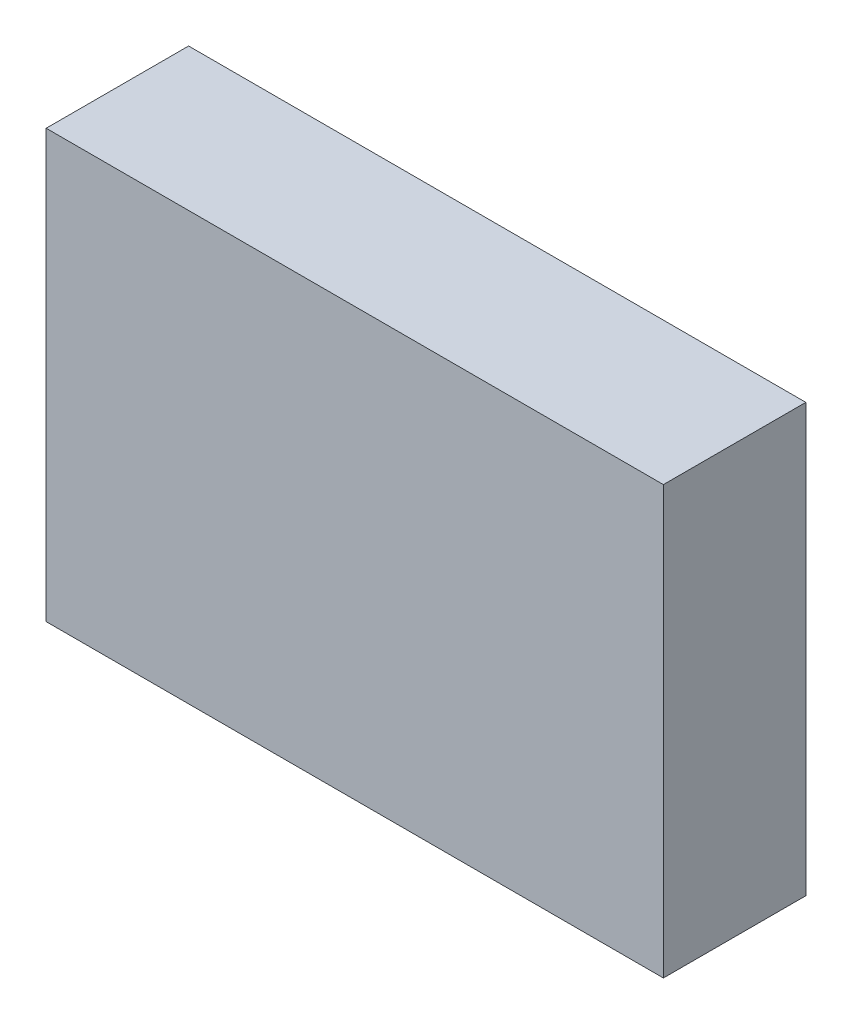
ISO-10303-21;
HEADER;
FILE_DESCRIPTION(('STEP AP214'),'2;1');
FILE_NAME('part.step','',(''),(''),'','','');
FILE_SCHEMA(('AUTOMOTIVE_DESIGN { 1 0 10303 214 1 1 1 1 }'));
ENDSEC;
DATA;
#1=APPLICATION_CONTEXT('core data for automotive mechanical design processes');
#2=APPLICATION_PROTOCOL_DEFINITION('international standard','automotive_design',2000,#1);
#3=PRODUCT_CONTEXT('',#1,'mechanical');
#4=PRODUCT('Part','Part','',(#3));
#5=PRODUCT_RELATED_PRODUCT_CATEGORY('part','',(#4));
#6=PRODUCT_DEFINITION_FORMATION('','',#4);
#7=PRODUCT_DEFINITION_CONTEXT('part definition',#1,'design');
#8=PRODUCT_DEFINITION('design','',#6,#7);
#9=PRODUCT_DEFINITION_SHAPE('','',#8);
#10=(LENGTH_UNIT() NAMED_UNIT(*) SI_UNIT(.MILLI.,.METRE.));
#11=(NAMED_UNIT(*) PLANE_ANGLE_UNIT() SI_UNIT($,.RADIAN.));
#12=(NAMED_UNIT(*) SI_UNIT($,.STERADIAN.) SOLID_ANGLE_UNIT());
#13=UNCERTAINTY_MEASURE_WITH_UNIT(LENGTH_MEASURE(1.E-05),#10,'distance_accuracy_value','');
#14=(GEOMETRIC_REPRESENTATION_CONTEXT(3) GLOBAL_UNCERTAINTY_ASSIGNED_CONTEXT((#13)) GLOBAL_UNIT_ASSIGNED_CONTEXT((#10,
#11,#12)) REPRESENTATION_CONTEXT('',''));
#15=CARTESIAN_POINT('',(0.,0.,0.));
#16=DIRECTION('',(0.,0.,1.));
#17=DIRECTION('',(1.,0.,0.));
#18=AXIS2_PLACEMENT_3D('',#15,#16,#17);
#19=CARTESIAN_POINT('',(-82.55,57.15,38.1));
#20=DIRECTION('',(1.,0.,0.));
#21=DIRECTION('',(0.,1.,0.));
#22=AXIS2_PLACEMENT_3D('',#19,#20,#21);
#23=PLANE('',#22);
#24=DIRECTION('',(0.,-1.,0.));
#25=VECTOR('',#24,1.);
#26=CARTESIAN_POINT('',(-82.55,57.15,0.));
#27=LINE('',#26,#25);
#28=CARTESIAN_POINT('',(-82.55,57.15,0.));
#29=VERTEX_POINT('',#28);
#30=CARTESIAN_POINT('',(-82.55,-57.15,0.));
#31=VERTEX_POINT('',#30);
#32=EDGE_CURVE('E97',#29,#31,#27,.T.);
#33=ORIENTED_EDGE('',*,*,#32,.T.);
#34=DIRECTION('',(0.,0.,-1.));
#35=VECTOR('',#34,1.);
#36=CARTESIAN_POINT('',(-82.55,-57.15,38.1));
#37=LINE('',#36,#35);
#38=CARTESIAN_POINT('',(-82.55,-57.15,38.1));
#39=VERTEX_POINT('',#38);
#40=EDGE_CURVE('E11',#39,#31,#37,.T.);
#41=ORIENTED_EDGE('',*,*,#40,.F.);
#42=DIRECTION('',(0.,-1.,0.));
#43=VECTOR('',#42,1.);
#44=CARTESIAN_POINT('',(-82.55,57.15,38.1));
#45=LINE('',#44,#43);
#46=CARTESIAN_POINT('',(-82.55,57.15,38.1));
#47=VERTEX_POINT('',#46);
#48=EDGE_CURVE('E85',#47,#39,#45,.T.);
#49=ORIENTED_EDGE('',*,*,#48,.F.);
#50=DIRECTION('',(0.,0.,-1.));
#51=VECTOR('',#50,1.);
#52=CARTESIAN_POINT('',(-82.55,57.15,38.1));
#53=LINE('',#52,#51);
#54=EDGE_CURVE('E93',#47,#29,#53,.T.);
#55=ORIENTED_EDGE('',*,*,#54,.T.);
#56=EDGE_LOOP('',(#33,#41,#49,#55));
#57=FACE_BOUND('',#56,.T.);
#58=ADVANCED_FACE('F34',(#57),#23,.F.);
#59=CARTESIAN_POINT('',(-82.55,-57.15,38.1));
#60=DIRECTION('',(0.,1.,0.));
#61=DIRECTION('',(0.,0.,1.));
#62=AXIS2_PLACEMENT_3D('',#59,#60,#61);
#63=PLANE('',#62);
#64=DIRECTION('',(1.,0.,0.));
#65=VECTOR('',#64,1.);
#66=CARTESIAN_POINT('',(-82.55,-57.15,0.));
#67=LINE('',#66,#65);
#68=CARTESIAN_POINT('',(82.55,-57.15,0.));
#69=VERTEX_POINT('',#68);
#70=EDGE_CURVE('E89',#31,#69,#67,.T.);
#71=ORIENTED_EDGE('',*,*,#70,.T.);
#72=DIRECTION('',(0.,0.,-1.));
#73=VECTOR('',#72,1.);
#74=CARTESIAN_POINT('',(82.55,-57.15,38.1));
#75=LINE('',#74,#73);
#76=CARTESIAN_POINT('',(82.55,-57.15,38.1));
#77=VERTEX_POINT('',#76);
#78=EDGE_CURVE('E42',#77,#69,#75,.T.);
#79=ORIENTED_EDGE('',*,*,#78,.F.);
#80=DIRECTION('',(1.,0.,0.));
#81=VECTOR('',#80,1.);
#82=CARTESIAN_POINT('',(-82.55,-57.15,38.1));
#83=LINE('',#82,#81);
#84=EDGE_CURVE('E80',#39,#77,#83,.T.);
#85=ORIENTED_EDGE('',*,*,#84,.F.);
#86=ORIENTED_EDGE('',*,*,#40,.T.);
#87=EDGE_LOOP('',(#71,#79,#85,#86));
#88=FACE_BOUND('',#87,.T.);
#89=ADVANCED_FACE('F88',(#88),#63,.F.);
#90=CARTESIAN_POINT('',(82.55,57.15,38.1));
#91=DIRECTION('',(-1.,0.,0.));
#92=DIRECTION('',(0.,-1.,0.));
#93=AXIS2_PLACEMENT_3D('',#90,#91,#92);
#94=PLANE('',#93);
#95=DIRECTION('',(0.,1.,0.));
#96=VECTOR('',#95,1.);
#97=CARTESIAN_POINT('',(82.55,57.15,0.));
#98=LINE('',#97,#96);
#99=CARTESIAN_POINT('',(82.55,57.15,0.));
#100=VERTEX_POINT('',#99);
#101=EDGE_CURVE('E67',#69,#100,#98,.T.);
#102=ORIENTED_EDGE('',*,*,#101,.T.);
#103=DIRECTION('',(0.,0.,-1.));
#104=VECTOR('',#103,1.);
#105=CARTESIAN_POINT('',(82.55,57.15,38.1));
#106=LINE('',#105,#104);
#107=CARTESIAN_POINT('',(82.55,57.15,38.1));
#108=VERTEX_POINT('',#107);
#109=EDGE_CURVE('E90',#108,#100,#106,.T.);
#110=ORIENTED_EDGE('',*,*,#109,.F.);
#111=DIRECTION('',(0.,1.,0.));
#112=VECTOR('',#111,1.);
#113=CARTESIAN_POINT('',(82.55,57.15,38.1));
#114=LINE('',#113,#112);
#115=EDGE_CURVE('E83',#77,#108,#114,.T.);
#116=ORIENTED_EDGE('',*,*,#115,.F.);
#117=ORIENTED_EDGE('',*,*,#78,.T.);
#118=EDGE_LOOP('',(#102,#110,#116,#117));
#119=FACE_BOUND('',#118,.T.);
#120=ADVANCED_FACE('F91',(#119),#94,.F.);
#121=CARTESIAN_POINT('',(-82.55,57.15,38.1));
#122=DIRECTION('',(0.,-1.,0.));
#123=DIRECTION('',(0.,0.,-1.));
#124=AXIS2_PLACEMENT_3D('',#121,#122,#123);
#125=PLANE('',#124);
#126=DIRECTION('',(-1.,0.,0.));
#127=VECTOR('',#126,1.);
#128=CARTESIAN_POINT('',(-82.55,57.15,0.));
#129=LINE('',#128,#127);
#130=EDGE_CURVE('E73',#100,#29,#129,.T.);
#131=ORIENTED_EDGE('',*,*,#130,.T.);
#132=ORIENTED_EDGE('',*,*,#54,.F.);
#133=DIRECTION('',(-1.,0.,0.));
#134=VECTOR('',#133,1.);
#135=CARTESIAN_POINT('',(-82.55,57.15,38.1));
#136=LINE('',#135,#134);
#137=EDGE_CURVE('E50',#108,#47,#136,.T.);
#138=ORIENTED_EDGE('',*,*,#137,.F.);
#139=ORIENTED_EDGE('',*,*,#109,.T.);
#140=EDGE_LOOP('',(#131,#132,#138,#139));
#141=FACE_BOUND('',#140,.T.);
#142=ADVANCED_FACE('F104',(#141),#125,.F.);
#143=CARTESIAN_POINT('',(0.,0.,38.1));
#144=DIRECTION('',(0.,0.,1.));
#145=DIRECTION('',(1.,0.,0.));
#146=AXIS2_PLACEMENT_3D('',#143,#144,#145);
#147=PLANE('',#146);
#148=ORIENTED_EDGE('',*,*,#48,.T.);
#149=ORIENTED_EDGE('',*,*,#84,.T.);
#150=ORIENTED_EDGE('',*,*,#115,.T.);
#151=ORIENTED_EDGE('',*,*,#137,.T.);
#152=EDGE_LOOP('',(#148,#149,#150,#151));
#153=FACE_BOUND('',#152,.T.);
#154=ADVANCED_FACE('F81',(#153),#147,.T.);
#155=CARTESIAN_POINT('',(0.,0.,0.));
#156=DIRECTION('',(0.,0.,1.));
#157=DIRECTION('',(1.,0.,0.));
#158=AXIS2_PLACEMENT_3D('',#155,#156,#157);
#159=PLANE('',#158);
#160=ORIENTED_EDGE('',*,*,#32,.F.);
#161=ORIENTED_EDGE('',*,*,#130,.F.);
#162=ORIENTED_EDGE('',*,*,#101,.F.);
#163=ORIENTED_EDGE('',*,*,#70,.F.);
#164=EDGE_LOOP('',(#160,#161,#162,#163));
#165=FACE_BOUND('',#164,.T.);
#166=ADVANCED_FACE('F107',(#165),#159,.F.);
#167=CLOSED_SHELL('',(#58,#89,#120,#142,#154,#166));
#168=MANIFOLD_SOLID_BREP('B2',#167);
#169=ADVANCED_BREP_SHAPE_REPRESENTATION('',(#18,#168),#14);
#170=SHAPE_DEFINITION_REPRESENTATION(#9,#169);
ENDSEC;
END-ISO-10303-21;
